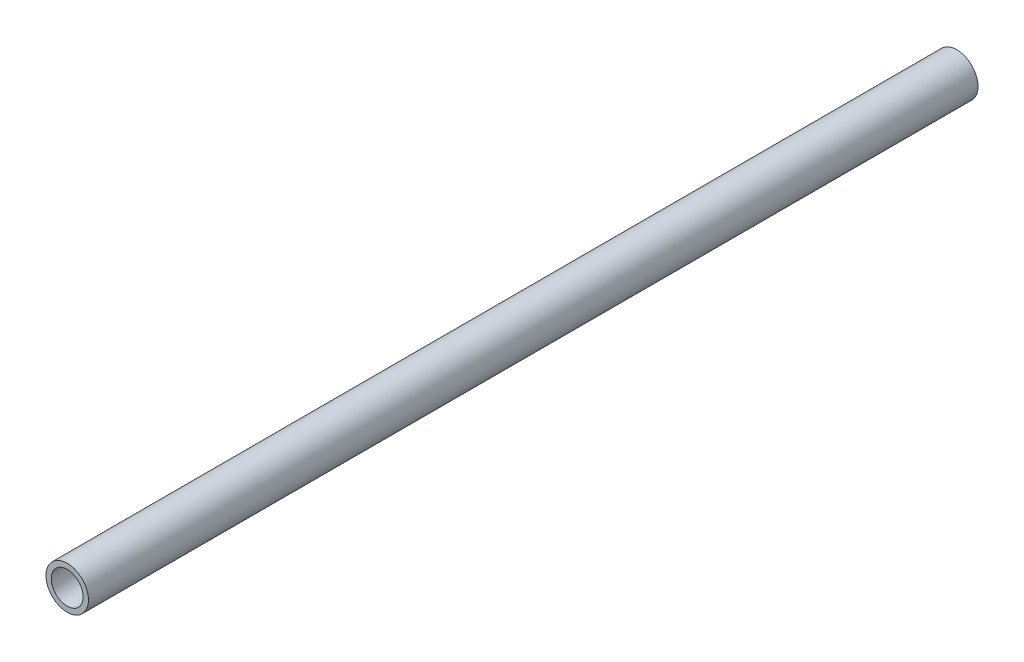
ISO-10303-21;
HEADER;
FILE_DESCRIPTION(('STEP AP214'),'2;1');
FILE_NAME('part.step','',(''),(''),'','','');
FILE_SCHEMA(('AUTOMOTIVE_DESIGN { 1 0 10303 214 1 1 1 1 }'));
ENDSEC;
DATA;
#1=APPLICATION_CONTEXT('core data for automotive mechanical design processes');
#2=APPLICATION_PROTOCOL_DEFINITION('international standard','automotive_design',2000,#1);
#3=PRODUCT_CONTEXT('',#1,'mechanical');
#4=PRODUCT('Part','Part','',(#3));
#5=PRODUCT_RELATED_PRODUCT_CATEGORY('part','',(#4));
#6=PRODUCT_DEFINITION_FORMATION('','',#4);
#7=PRODUCT_DEFINITION_CONTEXT('part definition',#1,'design');
#8=PRODUCT_DEFINITION('design','',#6,#7);
#9=PRODUCT_DEFINITION_SHAPE('','',#8);
#10=(LENGTH_UNIT() NAMED_UNIT(*) SI_UNIT(.MILLI.,.METRE.));
#11=(NAMED_UNIT(*) PLANE_ANGLE_UNIT() SI_UNIT($,.RADIAN.));
#12=(NAMED_UNIT(*) SI_UNIT($,.STERADIAN.) SOLID_ANGLE_UNIT());
#13=UNCERTAINTY_MEASURE_WITH_UNIT(LENGTH_MEASURE(1.E-05),#10,'distance_accuracy_value','');
#14=(GEOMETRIC_REPRESENTATION_CONTEXT(3) GLOBAL_UNCERTAINTY_ASSIGNED_CONTEXT((#13)) GLOBAL_UNIT_ASSIGNED_CONTEXT((#10,
#11,#12)) REPRESENTATION_CONTEXT('',''));
#15=CARTESIAN_POINT('',(0.,0.,0.));
#16=DIRECTION('',(0.,0.,1.));
#17=DIRECTION('',(1.,0.,0.));
#18=AXIS2_PLACEMENT_3D('',#15,#16,#17);
#19=CARTESIAN_POINT('',(0.,0.,335.));
#20=DIRECTION('',(0.,0.,1.));
#21=DIRECTION('',(1.,0.,0.));
#22=AXIS2_PLACEMENT_3D('',#19,#20,#21);
#23=PLANE('',#22);
#24=CARTESIAN_POINT('',(0.,0.,335.));
#25=DIRECTION('',(0.,0.,1.));
#26=DIRECTION('',(1.,0.,0.));
#27=AXIS2_PLACEMENT_3D('',#24,#25,#26);
#28=CIRCLE('',#27,8.);
#29=CARTESIAN_POINT('',(8.,0.,335.));
#30=VERTEX_POINT('',#29);
#31=EDGE_CURVE('E10',#30,#30,#28,.T.);
#32=ORIENTED_EDGE('',*,*,#31,.T.);
#33=EDGE_LOOP('',(#32));
#34=FACE_BOUND('',#33,.T.);
#35=CARTESIAN_POINT('',(0.,0.,335.));
#36=DIRECTION('',(0.,0.,1.));
#37=DIRECTION('',(1.,0.,0.));
#38=AXIS2_PLACEMENT_3D('',#35,#36,#37);
#39=CIRCLE('',#38,6.);
#40=CARTESIAN_POINT('',(6.,0.,335.));
#41=VERTEX_POINT('',#40);
#42=EDGE_CURVE('E46',#41,#41,#39,.T.);
#43=ORIENTED_EDGE('',*,*,#42,.F.);
#44=EDGE_LOOP('',(#43));
#45=FACE_BOUND('',#44,.T.);
#46=ADVANCED_FACE('F35',(#34,#45),#23,.T.);
#47=CARTESIAN_POINT('',(0.,0.,0.));
#48=DIRECTION('',(0.,0.,1.));
#49=DIRECTION('',(1.,0.,0.));
#50=AXIS2_PLACEMENT_3D('',#47,#48,#49);
#51=PLANE('',#50);
#52=CARTESIAN_POINT('',(0.,0.,0.));
#53=DIRECTION('',(0.,0.,1.));
#54=DIRECTION('',(1.,0.,0.));
#55=AXIS2_PLACEMENT_3D('',#52,#53,#54);
#56=CIRCLE('',#55,8.);
#57=CARTESIAN_POINT('',(8.,0.,0.));
#58=VERTEX_POINT('',#57);
#59=EDGE_CURVE('E39',#58,#58,#56,.T.);
#60=ORIENTED_EDGE('',*,*,#59,.F.);
#61=EDGE_LOOP('',(#60));
#62=FACE_BOUND('',#61,.T.);
#63=CARTESIAN_POINT('',(0.,0.,0.));
#64=DIRECTION('',(0.,0.,1.));
#65=DIRECTION('',(1.,0.,0.));
#66=AXIS2_PLACEMENT_3D('',#63,#64,#65);
#67=CIRCLE('',#66,6.);
#68=CARTESIAN_POINT('',(6.,0.,0.));
#69=VERTEX_POINT('',#68);
#70=EDGE_CURVE('E48',#69,#69,#67,.T.);
#71=ORIENTED_EDGE('',*,*,#70,.T.);
#72=EDGE_LOOP('',(#71));
#73=FACE_BOUND('',#72,.T.);
#74=ADVANCED_FACE('F58',(#62,#73),#51,.F.);
#75=CARTESIAN_POINT('',(0.,0.,335.));
#76=DIRECTION('',(0.,0.,-1.));
#77=DIRECTION('',(-1.,0.,0.));
#78=AXIS2_PLACEMENT_3D('',#75,#76,#77);
#79=CYLINDRICAL_SURFACE('',#78,8.);
#80=ORIENTED_EDGE('',*,*,#31,.F.);
#81=EDGE_LOOP('',(#80));
#82=FACE_BOUND('',#81,.T.);
#83=ORIENTED_EDGE('',*,*,#59,.T.);
#84=EDGE_LOOP('',(#83));
#85=FACE_BOUND('',#84,.T.);
#86=ADVANCED_FACE('F37',(#82,#85),#79,.T.);
#87=CARTESIAN_POINT('',(0.,0.,335.));
#88=DIRECTION('',(0.,0.,-1.));
#89=DIRECTION('',(-1.,0.,0.));
#90=AXIS2_PLACEMENT_3D('',#87,#88,#89);
#91=CYLINDRICAL_SURFACE('',#90,6.);
#92=ORIENTED_EDGE('',*,*,#42,.T.);
#93=EDGE_LOOP('',(#92));
#94=FACE_BOUND('',#93,.T.);
#95=ORIENTED_EDGE('',*,*,#70,.F.);
#96=EDGE_LOOP('',(#95));
#97=FACE_BOUND('',#96,.T.);
#98=ADVANCED_FACE('F54',(#94,#97),#91,.F.);
#99=CLOSED_SHELL('',(#46,#74,#86,#98));
#100=MANIFOLD_SOLID_BREP('B2',#99);
#101=ADVANCED_BREP_SHAPE_REPRESENTATION('',(#18,#100),#14);
#102=SHAPE_DEFINITION_REPRESENTATION(#9,#101);
ENDSEC;
END-ISO-10303-21;
